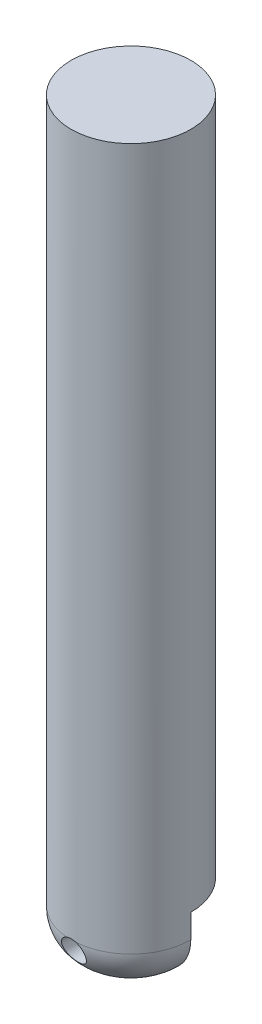
ISO-10303-21;
HEADER;
FILE_DESCRIPTION(('STEP AP214'),'2;1');
FILE_NAME('part.step','',(''),(''),'','','');
FILE_SCHEMA(('AUTOMOTIVE_DESIGN { 1 0 10303 214 1 1 1 1 }'));
ENDSEC;
DATA;
#1=APPLICATION_CONTEXT('core data for automotive mechanical design processes');
#2=APPLICATION_PROTOCOL_DEFINITION('international standard','automotive_design',2000,#1);
#3=PRODUCT_CONTEXT('',#1,'mechanical');
#4=PRODUCT('Part','Part','',(#3));
#5=PRODUCT_RELATED_PRODUCT_CATEGORY('part','',(#4));
#6=PRODUCT_DEFINITION_FORMATION('','',#4);
#7=PRODUCT_DEFINITION_CONTEXT('part definition',#1,'design');
#8=PRODUCT_DEFINITION('design','',#6,#7);
#9=PRODUCT_DEFINITION_SHAPE('','',#8);
#10=(LENGTH_UNIT() NAMED_UNIT(*) SI_UNIT(.MILLI.,.METRE.));
#11=(NAMED_UNIT(*) PLANE_ANGLE_UNIT() SI_UNIT($,.RADIAN.));
#12=(NAMED_UNIT(*) SI_UNIT($,.STERADIAN.) SOLID_ANGLE_UNIT());
#13=UNCERTAINTY_MEASURE_WITH_UNIT(LENGTH_MEASURE(1.E-05),#10,'distance_accuracy_value','');
#14=(GEOMETRIC_REPRESENTATION_CONTEXT(3) GLOBAL_UNCERTAINTY_ASSIGNED_CONTEXT((#13)) GLOBAL_UNIT_ASSIGNED_CONTEXT((#10,
#11,#12)) REPRESENTATION_CONTEXT('',''));
#15=CARTESIAN_POINT('',(0.,0.,0.));
#16=DIRECTION('',(0.,0.,1.));
#17=DIRECTION('',(1.,0.,0.));
#18=AXIS2_PLACEMENT_3D('',#15,#16,#17);
#19=CARTESIAN_POINT('',(0.,0.,0.));
#20=DIRECTION('',(0.,1.,0.));
#21=DIRECTION('',(0.,0.,1.));
#22=AXIS2_PLACEMENT_3D('',#19,#20,#21);
#23=PLANE('',#22);
#24=DIRECTION('',(1.,0.,0.));
#25=VECTOR('',#24,1.);
#26=CARTESIAN_POINT('',(-15.,0.,0.));
#27=LINE('',#26,#25);
#28=CARTESIAN_POINT('',(-15.,0.,0.));
#29=VERTEX_POINT('',#28);
#30=CARTESIAN_POINT('',(15.,0.,0.));
#31=VERTEX_POINT('',#30);
#32=EDGE_CURVE('E102',#29,#31,#27,.T.);
#33=ORIENTED_EDGE('',*,*,#32,.F.);
#34=CARTESIAN_POINT('',(0.,0.,0.));
#35=DIRECTION('',(0.,1.,0.));
#36=DIRECTION('',(0.,0.,1.));
#37=AXIS2_PLACEMENT_3D('',#34,#35,#36);
#38=CIRCLE('',#37,15.);
#39=EDGE_CURVE('E90',#31,#29,#38,.T.);
#40=ORIENTED_EDGE('',*,*,#39,.F.);
#41=EDGE_LOOP('',(#33,#40));
#42=FACE_BOUND('',#41,.T.);
#43=ADVANCED_FACE('F41',(#42),#23,.F.);
#44=CARTESIAN_POINT('',(0.,170.,0.));
#45=DIRECTION('',(0.,-1.,0.));
#46=DIRECTION('',(0.,0.,-1.));
#47=AXIS2_PLACEMENT_3D('',#44,#45,#46);
#48=CYLINDRICAL_SURFACE('',#47,15.);
#49=DIRECTION('',(0.,1.,0.));
#50=VECTOR('',#49,1.);
#51=CARTESIAN_POINT('',(-15.,-15.9821979638662,0.));
#52=LINE('',#51,#50);
#53=CARTESIAN_POINT('',(-15.,-5.9821979638662,0.));
#54=VERTEX_POINT('',#53);
#55=EDGE_CURVE('E97',#54,#29,#52,.T.);
#56=ORIENTED_EDGE('',*,*,#55,.F.);
#57=CARTESIAN_POINT('',(0.,-5.9821979638662,0.));
#58=DIRECTION('',(0.,1.,0.));
#59=DIRECTION('',(0.,0.,1.));
#60=AXIS2_PLACEMENT_3D('',#57,#58,#59);
#61=CIRCLE('',#60,15.);
#62=CARTESIAN_POINT('',(-1.19881469005989,-5.9821979638662,14.9520180356665));
#63=VERTEX_POINT('',#62);
#64=EDGE_CURVE('E56',#54,#63,#61,.T.);
#65=ORIENTED_EDGE('',*,*,#64,.T.);
#66=CARTESIAN_POINT('',(-3.,-8.73226038841162,14.6969384566991));
#67=CARTESIAN_POINT('',(-2.99999383762581,-8.56556726193815,14.6969417707994));
#68=CARTESIAN_POINT('',(-2.98605951515443,-8.3987965184116,14.6998052480611));
#69=CARTESIAN_POINT('',(-2.93073685074852,-8.06997287298223,14.7109329391462));
#70=CARTESIAN_POINT('',(-2.88932654121148,-7.90792385450368,14.7192014743436));
#71=CARTESIAN_POINT('',(-2.78038734785924,-7.59334847834899,14.7401662116556));
#72=CARTESIAN_POINT('',(-2.71288444245786,-7.44081282381385,14.7528580086323));
#73=CARTESIAN_POINT('',(-2.55374732301151,-7.14923585432075,14.7812339844198));
#74=CARTESIAN_POINT('',(-2.46211445580345,-7.01019378679791,14.7969179962038));
#75=CARTESIAN_POINT('',(-2.25593722696031,-6.74757737685004,14.8297589908276));
#76=CARTESIAN_POINT('',(-2.14111696773996,-6.6242216247597,14.8469321351174));
#77=CARTESIAN_POINT('',(-1.89242036706393,-6.39838778767468,14.880674169078));
#78=CARTESIAN_POINT('',(-1.75854269093395,-6.29591116616004,14.8972430163249));
#79=CARTESIAN_POINT('',(-1.47408406777277,-6.11389633552624,14.9280838925269));
#80=CARTESIAN_POINT('',(-1.32336770301663,-6.0345658469617,14.9423346432465));
#81=CARTESIAN_POINT('',(-1.01041245116182,-5.90243557726721,14.9667521065089));
#82=CARTESIAN_POINT('',(-0.84817464426166,-5.84963331270865,14.9769192013236));
#83=CARTESIAN_POINT('',(-0.519050319835484,-5.77273880755275,14.9919096206526));
#84=CARTESIAN_POINT('',(-0.352253217644444,-5.7482774556986,14.9968015886438));
#85=CARTESIAN_POINT('',(-0.0168557053126103,-5.72760753289667,15.0009276355081));
#86=CARTESIAN_POINT('',(0.151744529495528,-5.73139623947415,15.0001622595828));
#87=CARTESIAN_POINT('',(0.483426002230764,-5.76683892905828,14.9931130460555));
#88=CARTESIAN_POINT('',(0.646551642895409,-5.79809531991516,14.9869079509751));
#89=CARTESIAN_POINT('',(0.965194879740902,-5.8869554857883,14.9697653147823));
#90=CARTESIAN_POINT('',(1.12071217124139,-5.94456031498724,14.9588275843212));
#91=CARTESIAN_POINT('',(1.42085838960266,-6.08485050885342,14.9333188805988));
#92=CARTESIAN_POINT('',(1.5654125224017,-6.16769164172628,14.9187254452567));
#93=CARTESIAN_POINT('',(1.83871513757927,-6.35598762012142,14.8875140842136));
#94=CARTESIAN_POINT('',(1.967461798575,-6.46144506772317,14.8708959256567));
#95=CARTESIAN_POINT('',(2.20785429316037,-6.69416125473704,14.8371289309338));
#96=CARTESIAN_POINT('',(2.31916294972089,-6.82176794860039,14.8199758937255));
#97=CARTESIAN_POINT('',(2.51885547953042,-7.09400971576387,14.7873471479628));
#98=CARTESIAN_POINT('',(2.60723891918325,-7.2386451110612,14.7718714711364));
#99=CARTESIAN_POINT('',(2.75868844440564,-7.54132288387703,14.7443414241877));
#100=CARTESIAN_POINT('',(2.82169994333313,-7.6993932913306,14.7322944469065));
#101=CARTESIAN_POINT('',(2.92017102488275,-8.02417435958359,14.7130942896382));
#102=CARTESIAN_POINT('',(2.95563419836993,-8.19088389126887,14.7059404718528));
#103=CARTESIAN_POINT('',(2.99749801810815,-8.52515496240875,14.6974643780348));
#104=CARTESIAN_POINT('',(3.00438557669374,-8.69265311134264,14.6960444117146));
#105=CARTESIAN_POINT('',(2.99021288493222,-9.02640505801067,14.6989345706656));
#106=CARTESIAN_POINT('',(2.96915421936733,-9.19265892576821,14.7032443710116));
#107=CARTESIAN_POINT('',(2.90010662422247,-9.51756630928833,14.7170169748474));
#108=CARTESIAN_POINT('',(2.85237786251789,-9.67627741751891,14.7264299704349));
#109=CARTESIAN_POINT('',(2.73162310592555,-9.98345022549784,14.7493046805499));
#110=CARTESIAN_POINT('',(2.65859502711953,-10.1319110797188,14.7627667285881));
#111=CARTESIAN_POINT('',(2.48821242664679,-10.4164997182621,14.7924421788612));
#112=CARTESIAN_POINT('',(2.39055323394826,-10.5524415273141,14.8086891559471));
#113=CARTESIAN_POINT('',(2.17408671663814,-10.8061853244144,14.8420117147991));
#114=CARTESIAN_POINT('',(2.05527721543361,-10.9239854431594,14.8590873817145));
#115=CARTESIAN_POINT('',(1.79769682049367,-11.1399480659684,14.8924603760765));
#116=CARTESIAN_POINT('',(1.65864749678889,-11.2377813523616,14.9087417312605));
#117=CARTESIAN_POINT('',(1.36580368990427,-11.4086980329104,14.9384138288586));
#118=CARTESIAN_POINT('',(1.21200982630052,-11.481782466446,14.9518046926563));
#119=CARTESIAN_POINT('',(0.894908042472037,-11.6006470036515,14.974118821832));
#120=CARTESIAN_POINT('',(0.731660020434234,-11.6465819430904,14.9830673742781));
#121=CARTESIAN_POINT('',(0.399568364039734,-11.7103341314032,14.9955970781298));
#122=CARTESIAN_POINT('',(0.230725406133635,-11.7281547668387,14.9991788759955));
#123=CARTESIAN_POINT('',(-0.104618681710864,-11.7350413313003,15.0005562136234));
#124=CARTESIAN_POINT('',(-0.271109436424483,-11.7246022297803,14.9984513564799));
#125=CARTESIAN_POINT('',(-0.599913093946951,-11.6763585367681,14.9889013068102));
#126=CARTESIAN_POINT('',(-0.762226049261168,-11.6385542893672,14.9814561814329));
#127=CARTESIAN_POINT('',(-1.07775824923519,-11.5368734121369,14.9620649509476));
#128=CARTESIAN_POINT('',(-1.23099732972049,-11.4730562540187,14.9501291174284));
#129=CARTESIAN_POINT('',(-1.52466366055821,-11.3212236644183,14.9230416637104));
#130=CARTESIAN_POINT('',(-1.66508989730354,-11.2332063206981,14.9078897894096));
#131=CARTESIAN_POINT('',(-1.93159167031775,-11.0338022272278,14.8757279747022));
#132=CARTESIAN_POINT('',(-2.05739914834453,-10.9220613792603,14.858692002537));
#133=CARTESIAN_POINT('',(-2.28864785327552,-10.6791096681153,14.8248366872359));
#134=CARTESIAN_POINT('',(-2.39408424962674,-10.5478941999718,14.8080173963616));
#135=CARTESIAN_POINT('',(-2.58267665834994,-10.2680224383403,14.7763002820179));
#136=CARTESIAN_POINT('',(-2.66558044385427,-10.1191935050479,14.7614251071368));
#137=CARTESIAN_POINT('',(-2.80507214779868,-9.80946206863132,14.7355571137924));
#138=CARTESIAN_POINT('',(-2.86168393792249,-9.64857067235005,14.7245607757495));
#139=CARTESIAN_POINT('',(-2.93600741957297,-9.361473022083,14.7098904341354));
#140=CARTESIAN_POINT('',(-2.95996169557105,-9.23690412986975,14.7050635474382));
#141=CARTESIAN_POINT('',(-2.99196005387913,-8.98565852475821,14.6985863537725));
#142=CARTESIAN_POINT('',(-3.00000468468793,-8.85898188467821,14.6969359372925));
#143=CARTESIAN_POINT('',(-3.,-8.73226038841162,14.6969384566991));
#144=B_SPLINE_CURVE_WITH_KNOTS('',3,(#66,#67,#68,#69,#70,#71,#72,#73,#74,#75,#76,#77,#78,#79,
#80,#81,#82,#83,#84,#85,#86,#87,#88,#89,#90,#91,#92,#93,#94,#95,#96,#97,#98,#99,#100,#101,#102,
#103,#104,#105,#106,#107,#108,#109,#110,#111,#112,#113,#114,#115,#116,#117,#118,#119,#120,#121,
#122,#123,#124,#125,#126,#127,#128,#129,#130,#131,#132,#133,#134,#135,#136,#137,#138,#139,#140,
#141,#142,#143),.UNSPECIFIED.,.T.,.F.,(4,2,2,2,2,2,2,2,2,2,2,2,2,2,2,2,2,2,2,2,2,2,2,2,2,2,2,2,
2,2,2,2,2,2,2,2,2,2,4),(0.,0.499615391608283,0.999630717852889,1.49914949382176,
1.99864039457959,2.5044675764531,3.01033020106266,3.5206020131235,4.03082604739679,
4.53432746649241,5.03778036348745,5.53406368900612,6.03036687221251,6.52979772666909,
7.02928607310198,7.5374804028745,8.04568434368161,8.5549758951833,9.06420105048074,
9.5647127341378,10.0651960358526,10.5608802534996,11.0566053106319,11.5587917932356,
12.0610299861063,12.5709780520035,13.0809046989031,13.5878944073595,14.0948230407488,
14.5929305224406,15.0910317410027,15.5880005122635,16.0850085640405,16.5900345607679,
17.0951801666934,17.6057669573882,18.1158892527059,18.4957141091448,18.8755258705644),.UNSPECIFIED.);
#145=CARTESIAN_POINT('',(1.19881469005989,-5.9821979638662,14.9520180356665));
#146=VERTEX_POINT('',#145);
#147=EDGE_CURVE('E109',#63,#146,#144,.T.);
#148=ORIENTED_EDGE('',*,*,#147,.T.);
#149=CARTESIAN_POINT('',(0.,-5.9821979638662,0.));
#150=DIRECTION('',(0.,1.,0.));
#151=DIRECTION('',(0.,0.,1.));
#152=AXIS2_PLACEMENT_3D('',#149,#150,#151);
#153=CIRCLE('',#152,15.);
#154=CARTESIAN_POINT('',(15.,-5.9821979638662,0.));
#155=VERTEX_POINT('',#154);
#156=EDGE_CURVE('E92',#146,#155,#153,.T.);
#157=ORIENTED_EDGE('',*,*,#156,.T.);
#158=DIRECTION('',(0.,1.,0.));
#159=VECTOR('',#158,1.);
#160=CARTESIAN_POINT('',(15.,-15.9821979638662,0.));
#161=LINE('',#160,#159);
#162=EDGE_CURVE('E86',#155,#31,#161,.T.);
#163=ORIENTED_EDGE('',*,*,#162,.T.);
#164=ORIENTED_EDGE('',*,*,#39,.T.);
#165=EDGE_LOOP('',(#56,#65,#148,#157,#163,#164));
#166=FACE_BOUND('',#165,.T.);
#167=CARTESIAN_POINT('',(0.,170.,0.));
#168=DIRECTION('',(0.,1.,0.));
#169=DIRECTION('',(0.,0.,1.));
#170=AXIS2_PLACEMENT_3D('',#167,#168,#169);
#171=CIRCLE('',#170,15.);
#172=CARTESIAN_POINT('',(0.,170.,15.));
#173=VERTEX_POINT('',#172);
#174=EDGE_CURVE('E104',#173,#173,#171,.T.);
#175=ORIENTED_EDGE('',*,*,#174,.F.);
#176=EDGE_LOOP('',(#175));
#177=FACE_BOUND('',#176,.T.);
#178=ADVANCED_FACE('F88',(#166,#177),#48,.T.);
#179=CARTESIAN_POINT('',(0.,170.,0.));
#180=DIRECTION('',(0.,1.,0.));
#181=DIRECTION('',(0.,0.,1.));
#182=AXIS2_PLACEMENT_3D('',#179,#180,#181);
#183=PLANE('',#182);
#184=ORIENTED_EDGE('',*,*,#174,.T.);
#185=EDGE_LOOP('',(#184));
#186=FACE_BOUND('',#185,.T.);
#187=ADVANCED_FACE('F147',(#186),#183,.T.);
#188=CARTESIAN_POINT('',(-15.,-15.9821979638662,0.));
#189=DIRECTION('',(0.,0.,1.));
#190=DIRECTION('',(1.,0.,0.));
#191=AXIS2_PLACEMENT_3D('',#188,#189,#190);
#192=PLANE('',#191);
#193=CARTESIAN_POINT('',(0.,-8.73226038841162,0.));
#194=DIRECTION('',(0.,0.,-1.));
#195=DIRECTION('',(-1.,0.,0.));
#196=AXIS2_PLACEMENT_3D('',#193,#194,#195);
#197=CIRCLE('',#196,3.);
#198=CARTESIAN_POINT('',(-3.,-8.73226038841162,0.));
#199=VERTEX_POINT('',#198);
#200=EDGE_CURVE('E115',#199,#199,#197,.T.);
#201=ORIENTED_EDGE('',*,*,#200,.F.);
#202=EDGE_LOOP('',(#201));
#203=FACE_BOUND('',#202,.T.);
#204=DIRECTION('',(1.,0.,0.));
#205=VECTOR('',#204,1.);
#206=CARTESIAN_POINT('',(-15.,-15.9821979638662,0.));
#207=LINE('',#206,#205);
#208=CARTESIAN_POINT('',(-5.,-15.9821979638662,0.));
#209=VERTEX_POINT('',#208);
#210=CARTESIAN_POINT('',(5.,-15.9821979638662,0.));
#211=VERTEX_POINT('',#210);
#212=EDGE_CURVE('E98',#209,#211,#207,.T.);
#213=ORIENTED_EDGE('',*,*,#212,.F.);
#214=CARTESIAN_POINT('',(-5.,-5.9821979638662,0.));
#215=DIRECTION('',(0.,0.,1.));
#216=DIRECTION('',(1.,0.,0.));
#217=AXIS2_PLACEMENT_3D('',#214,#215,#216);
#218=CIRCLE('',#217,10.);
#219=EDGE_CURVE('E130',#209,#54,#218,.F.);
#220=ORIENTED_EDGE('',*,*,#219,.T.);
#221=ORIENTED_EDGE('',*,*,#55,.T.);
#222=ORIENTED_EDGE('',*,*,#32,.T.);
#223=ORIENTED_EDGE('',*,*,#162,.F.);
#224=CARTESIAN_POINT('',(5.,-5.9821979638662,0.));
#225=DIRECTION('',(0.,0.,1.));
#226=DIRECTION('',(1.,0.,0.));
#227=AXIS2_PLACEMENT_3D('',#224,#225,#226);
#228=CIRCLE('',#227,10.);
#229=EDGE_CURVE('E127',#155,#211,#228,.F.);
#230=ORIENTED_EDGE('',*,*,#229,.T.);
#231=EDGE_LOOP('',(#213,#220,#221,#222,#223,#230));
#232=FACE_BOUND('',#231,.T.);
#233=ADVANCED_FACE('F107',(#203,#232),#192,.F.);
#234=CARTESIAN_POINT('',(0.,-15.9821979638662,0.));
#235=DIRECTION('',(0.,1.,0.));
#236=DIRECTION('',(0.,0.,1.));
#237=AXIS2_PLACEMENT_3D('',#234,#235,#236);
#238=PLANE('',#237);
#239=ORIENTED_EDGE('',*,*,#212,.T.);
#240=CARTESIAN_POINT('',(0.,-15.9821979638662,0.));
#241=DIRECTION('',(0.,1.,0.));
#242=DIRECTION('',(0.,0.,1.));
#243=AXIS2_PLACEMENT_3D('',#240,#241,#242);
#244=CIRCLE('',#243,5.);
#245=EDGE_CURVE('E122',#211,#209,#244,.F.);
#246=ORIENTED_EDGE('',*,*,#245,.T.);
#247=EDGE_LOOP('',(#239,#246));
#248=FACE_BOUND('',#247,.T.);
#249=ADVANCED_FACE('F138',(#248),#238,.F.);
#250=CARTESIAN_POINT('',(0.,-8.73226038841162,19.));
#251=DIRECTION('',(0.,0.,-1.));
#252=DIRECTION('',(-1.,0.,0.));
#253=AXIS2_PLACEMENT_3D('',#250,#251,#252);
#254=CYLINDRICAL_SURFACE('',#253,3.);
#255=ORIENTED_EDGE('',*,*,#200,.T.);
#256=EDGE_LOOP('',(#255));
#257=FACE_BOUND('',#256,.T.);
#258=ORIENTED_EDGE('',*,*,#147,.F.);
#259=CARTESIAN_POINT('',(-1.19881469005989,-5.9821979638662,14.9520180356665));
#260=CARTESIAN_POINT('',(-1.27579841140207,-6.01574688993733,14.945846135387));
#261=CARTESIAN_POINT('',(-1.35131710726951,-6.05252356576186,14.9390230479234));
#262=CARTESIAN_POINT('',(-1.49890379412387,-6.13220168316435,14.9240548676142));
#263=CARTESIAN_POINT('',(-1.57097216119885,-6.17510245517286,14.9159099192791));
#264=CARTESIAN_POINT('',(-1.71105314579071,-6.26663922059428,14.8982898056723));
#265=CARTESIAN_POINT('',(-1.7790714818289,-6.3152668241749,14.8888165825422));
#266=CARTESIAN_POINT('',(-1.91067949026205,-6.41789708976359,14.868520701068));
#267=CARTESIAN_POINT('',(-1.97426915995019,-6.47189975505689,14.8576980418992));
#268=CARTESIAN_POINT('',(-2.15775462255297,-6.64138679155675,14.8231794017417));
#269=CARTESIAN_POINT('',(-2.27046578516386,-6.76441511142073,14.7974205209882));
#270=CARTESIAN_POINT('',(-2.47345427660465,-7.02652125149771,14.7404764018025));
#271=CARTESIAN_POINT('',(-2.56373196065245,-7.16559881753143,14.7092912493046));
#272=CARTESIAN_POINT('',(-2.72077530430108,-7.45744585386178,14.6412728893141));
#273=CARTESIAN_POINT('',(-2.78724499321126,-7.61035993287991,14.6043762381906));
#274=CARTESIAN_POINT('',(-2.89379091761962,-7.92391966999471,14.525645188157));
#275=CARTESIAN_POINT('',(-2.93386065195673,-8.08456722206612,14.483809575984));
#276=CARTESIAN_POINT('',(-2.98783388787479,-8.4137467563617,14.3946147305171));
#277=CARTESIAN_POINT('',(-3.00095770729905,-8.58237289596515,14.3471319008767));
#278=CARTESIAN_POINT('',(-2.99893273417788,-8.91840660233707,14.2486472033081));
#279=CARTESIAN_POINT('',(-2.98378028237997,-9.08581400857383,14.1976448807423));
#280=CARTESIAN_POINT('',(-2.92499917036185,-9.42099314708885,14.0915100065697));
#281=CARTESIAN_POINT('',(-2.88037143015164,-9.58856376835667,14.036294976005));
#282=CARTESIAN_POINT('',(-2.76311390393101,-9.91337529926958,13.925139478716));
#283=CARTESIAN_POINT('',(-2.69047746215543,-10.0706137432557,13.8691988426202));
#284=CARTESIAN_POINT('',(-2.51693406601862,-10.3743235876373,13.7572941809445));
#285=CARTESIAN_POINT('',(-2.4153801513961,-10.5204383568966,13.7013629337817));
#286=CARTESIAN_POINT('',(-2.18715363492746,-10.7933268583128,13.5935061066229));
#287=CARTESIAN_POINT('',(-2.0604791863438,-10.9200991672945,13.5415808215156));
#288=CARTESIAN_POINT('',(-1.78733705169156,-11.1481505329837,13.4456215438077));
#289=CARTESIAN_POINT('',(-1.64125071359628,-11.2498335648751,13.4014663174494));
#290=CARTESIAN_POINT('',(-1.33134230341304,-11.4265669895342,13.3231536702877));
#291=CARTESIAN_POINT('',(-1.16753120970407,-11.5016337460698,13.288990108849));
#292=CARTESIAN_POINT('',(-0.839843789421259,-11.6171443530022,13.2357587498658));
#293=CARTESIAN_POINT('',(-0.676885032065348,-11.6597543339566,13.2157544985013));
#294=CARTESIAN_POINT('',(-0.345116676565254,-11.7170851560922,13.1887286822856));
#295=CARTESIAN_POINT('',(-0.176310936362887,-11.7318240431412,13.181698716965));
#296=CARTESIAN_POINT('',(0.147674593471523,-11.7326434932706,13.1813071034168));
#297=CARTESIAN_POINT('',(0.302852923914733,-11.7209441245168,13.186886617197));
#298=CARTESIAN_POINT('',(0.608754929419819,-11.6739199072808,13.209091787529));
#299=CARTESIAN_POINT('',(0.75947865766869,-11.6385953409974,13.2257173121382));
#300=CARTESIAN_POINT('',(1.05151550887552,-11.5460915905666,13.2685791906318));
#301=CARTESIAN_POINT('',(1.19288098187309,-11.4890486664859,13.2947555809426));
#302=CARTESIAN_POINT('',(1.46404568410948,-11.355132015954,13.3549705303641));
#303=CARTESIAN_POINT('',(1.59384192470644,-11.2782531852192,13.3890111128954));
#304=CARTESIAN_POINT('',(1.84797486951597,-11.1009401878561,13.4656382616843));
#305=CARTESIAN_POINT('',(1.97129220224526,-10.999233203488,13.5086564401502));
#306=CARTESIAN_POINT('',(2.19947043664175,-10.7786086866446,13.5992518710097));
#307=CARTESIAN_POINT('',(2.30432440611963,-10.6596847203487,13.6468308254657));
#308=CARTESIAN_POINT('',(2.50140871840005,-10.3972019759823,13.7485166504358));
#309=CARTESIAN_POINT('',(2.59190815198704,-10.2524243958613,13.8028392812142));
#310=CARTESIAN_POINT('',(2.74706298174929,-9.94986686818908,13.9122294673225));
#311=CARTESIAN_POINT('',(2.81171182374004,-9.79208363538682,13.9672972079142));
#312=CARTESIAN_POINT('',(2.91550225505124,-9.4610296591406,14.0784705065135));
#313=CARTESIAN_POINT('',(2.95353096725897,-9.28739290225919,14.1345306539348));
#314=CARTESIAN_POINT('',(2.9983866061838,-8.93520254121033,14.2436780949592));
#315=CARTESIAN_POINT('',(3.00521382527727,-8.75664898313197,14.2967654164148));
#316=CARTESIAN_POINT('',(2.98697019960906,-8.40171175040219,14.3980493164603));
#317=CARTESIAN_POINT('',(2.96222114431572,-8.22532438846672,14.4462899140376));
#318=CARTESIAN_POINT('',(2.88143665553,-7.87843794903952,14.5374359908644));
#319=CARTESIAN_POINT('',(2.82540990853075,-7.70793725064757,14.5803429473382));
#320=CARTESIAN_POINT('',(2.68567826438348,-7.38425433982057,14.6587237962433));
#321=CARTESIAN_POINT('',(2.60300935854311,-7.2306750786136,14.6944050918154));
#322=CARTESIAN_POINT('',(2.41152569451439,-6.93923825713951,14.7598057808628));
#323=CARTESIAN_POINT('',(2.30270373866876,-6.80138504031162,14.7895235289542));
#324=CARTESIAN_POINT('',(2.06590185356626,-6.55031253111533,14.8420011241687));
#325=CARTESIAN_POINT('',(1.93865221085316,-6.43644261567025,14.8649543127859));
#326=CARTESIAN_POINT('',(1.66625060523458,-6.23175914488353,14.9051915611472));
#327=CARTESIAN_POINT('',(1.52113870691626,-6.14089533898976,14.9224880010604));
#328=CARTESIAN_POINT('',(1.34140595044917,-6.0486752163438,14.9397158252786));
#329=CARTESIAN_POINT('',(1.31317227941408,-6.03474775956537,14.9423066685574));
#330=CARTESIAN_POINT('',(1.25630094436727,-6.00779852779963,14.947300992619));
#331=CARTESIAN_POINT('',(1.22766380022033,-5.99477569638224,14.9497046923603));
#332=CARTESIAN_POINT('',(1.19881469005989,-5.9821979638662,14.9520180356665));
#333=B_SPLINE_CURVE_WITH_KNOTS('',3,(#259,#260,#261,#262,#263,#264,#265,#266,#267,#268,#269,
#270,#271,#272,#273,#274,#275,#276,#277,#278,#279,#280,#281,#282,#283,#284,#285,#286,#287,#288,
#289,#290,#291,#292,#293,#294,#295,#296,#297,#298,#299,#300,#301,#302,#303,#304,#305,#306,#307,
#308,#309,#310,#311,#312,#313,#314,#315,#316,#317,#318,#319,#320,#321,#322,#323,#324,#325,#326,
#327,#328,#329,#330,#331,#332),.UNSPECIFIED.,.F.,.F.,(4,2,2,2,2,2,2,2,2,2,2,2,2,2,2,2,2,2,2,2,2,
2,2,2,2,2,2,2,2,2,2,2,2,2,2,2,4),(0.,0.252522745730939,0.505017903358358,0.757147651328375,
1.00927755340035,1.51318502373363,2.01708451454804,2.5270470142885,3.03713504873062,
3.56178565324596,4.08650415787987,4.62998941963747,5.17360391058141,5.73049149063082,
6.28742002549099,6.83469037601366,7.38162367723479,7.88773192721904,8.39351237184589,
8.85841227330209,9.32330662170884,9.7853310639481,10.2474745156165,10.741991516421,
11.236693792773,11.7718077620715,12.3070573187977,12.863527400065,13.4199922668693,
13.9708313112395,14.5215174517132,15.0529535707703,15.58453611574,16.0989901473634,
16.6123106080849,16.7070695877903,16.8017159790006),.UNSPECIFIED.);
#334=EDGE_CURVE('E11',#63,#146,#333,.T.);
#335=ORIENTED_EDGE('',*,*,#334,.T.);
#336=EDGE_LOOP('',(#258,#335));
#337=FACE_BOUND('',#336,.T.);
#338=ADVANCED_FACE('F140',(#257,#337),#254,.F.);
#339=CARTESIAN_POINT('',(0.,-5.9821979638662,0.));
#340=DIRECTION('',(0.,1.,0.));
#341=DIRECTION('',(0.,0.,1.));
#342=AXIS2_PLACEMENT_3D('',#339,#340,#341);
#343=DEGENERATE_TOROIDAL_SURFACE('',#342,5.,10.,.T.);
#344=ORIENTED_EDGE('',*,*,#334,.F.);
#345=ORIENTED_EDGE('',*,*,#64,.F.);
#346=ORIENTED_EDGE('',*,*,#219,.F.);
#347=ORIENTED_EDGE('',*,*,#245,.F.);
#348=ORIENTED_EDGE('',*,*,#229,.F.);
#349=ORIENTED_EDGE('',*,*,#156,.F.);
#350=EDGE_LOOP('',(#344,#345,#346,#347,#348,#349));
#351=FACE_BOUND('',#350,.T.);
#352=ADVANCED_FACE('F43',(#351),#343,.T.);
#353=CLOSED_SHELL('',(#43,#178,#187,#233,#249,#338,#352));
#354=MANIFOLD_SOLID_BREP('B2',#353);
#355=ADVANCED_BREP_SHAPE_REPRESENTATION('',(#18,#354),#14);
#356=SHAPE_DEFINITION_REPRESENTATION(#9,#355);
ENDSEC;
END-ISO-10303-21;
